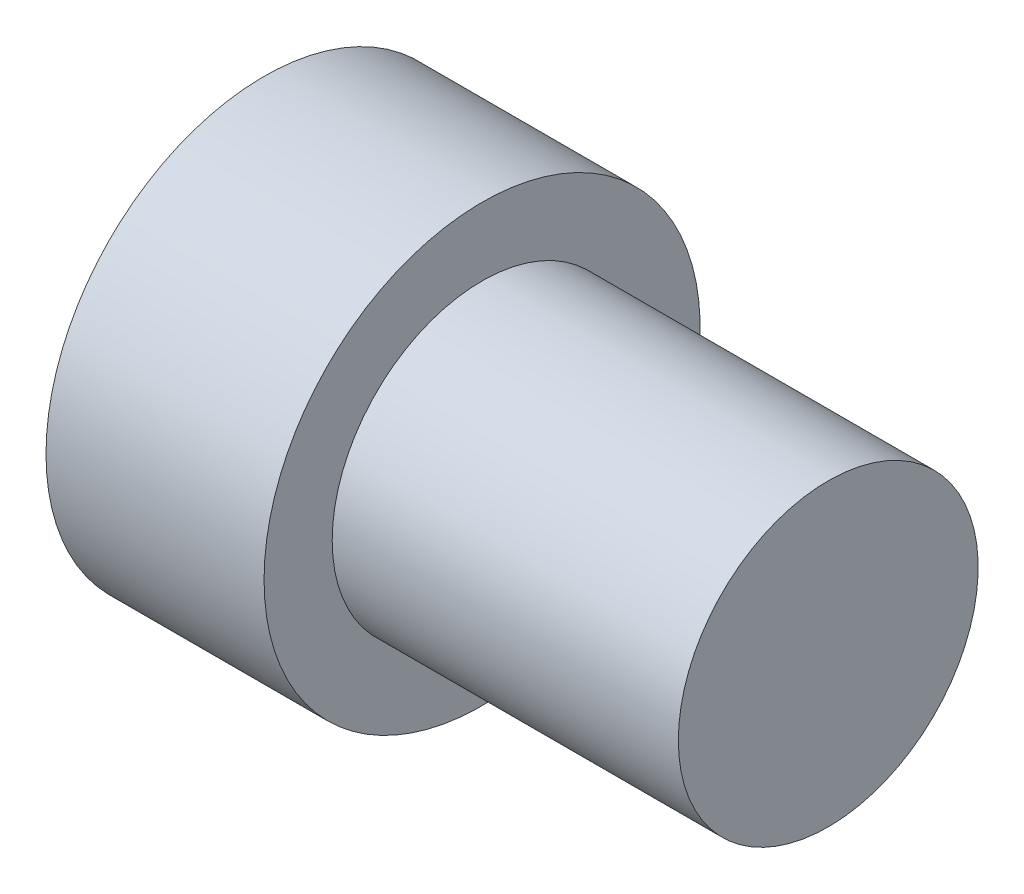
ISO-10303-21;
HEADER;
FILE_DESCRIPTION(('STEP AP214'),'2;1');
FILE_NAME('part.step','',(''),(''),'','','');
FILE_SCHEMA(('AUTOMOTIVE_DESIGN { 1 0 10303 214 1 1 1 1 }'));
ENDSEC;
DATA;
#1=APPLICATION_CONTEXT('core data for automotive mechanical design processes');
#2=APPLICATION_PROTOCOL_DEFINITION('international standard','automotive_design',2000,#1);
#3=PRODUCT_CONTEXT('',#1,'mechanical');
#4=PRODUCT('Part','Part','',(#3));
#5=PRODUCT_RELATED_PRODUCT_CATEGORY('part','',(#4));
#6=PRODUCT_DEFINITION_FORMATION('','',#4);
#7=PRODUCT_DEFINITION_CONTEXT('part definition',#1,'design');
#8=PRODUCT_DEFINITION('design','',#6,#7);
#9=PRODUCT_DEFINITION_SHAPE('','',#8);
#10=(LENGTH_UNIT() NAMED_UNIT(*) SI_UNIT(.MILLI.,.METRE.));
#11=(NAMED_UNIT(*) PLANE_ANGLE_UNIT() SI_UNIT($,.RADIAN.));
#12=(NAMED_UNIT(*) SI_UNIT($,.STERADIAN.) SOLID_ANGLE_UNIT());
#13=UNCERTAINTY_MEASURE_WITH_UNIT(LENGTH_MEASURE(1.E-05),#10,'distance_accuracy_value','');
#14=(GEOMETRIC_REPRESENTATION_CONTEXT(3) GLOBAL_UNCERTAINTY_ASSIGNED_CONTEXT((#13)) GLOBAL_UNIT_ASSIGNED_CONTEXT((#10,
#11,#12)) REPRESENTATION_CONTEXT('',''));
#15=CARTESIAN_POINT('',(0.,0.,0.));
#16=DIRECTION('',(0.,0.,1.));
#17=DIRECTION('',(1.,0.,0.));
#18=AXIS2_PLACEMENT_3D('',#15,#16,#17);
#19=CARTESIAN_POINT('',(12.7,0.,0.));
#20=DIRECTION('',(-1.,0.,0.));
#21=DIRECTION('',(0.,0.,1.));
#22=AXIS2_PLACEMENT_3D('',#19,#20,#21);
#23=PLANE('',#22);
#24=CARTESIAN_POINT('',(12.6999999999999,0.,0.));
#25=DIRECTION('',(-1.,0.,0.));
#26=DIRECTION('',(0.,0.,1.));
#27=AXIS2_PLACEMENT_3D('',#24,#25,#26);
#28=CIRCLE('',#27,5.5);
#29=CARTESIAN_POINT('',(12.6999999999999,0.,5.5));
#30=VERTEX_POINT('',#29);
#31=EDGE_CURVE('E10',#30,#30,#28,.T.);
#32=ORIENTED_EDGE('',*,*,#31,.F.);
#33=EDGE_LOOP('',(#32));
#34=FACE_BOUND('',#33,.T.);
#35=ADVANCED_FACE('F39',(#34),#23,.F.);
#36=CARTESIAN_POINT('',(-1000.,0.,0.));
#37=DIRECTION('',(-1.,0.,0.));
#38=DIRECTION('',(0.,0.,1.));
#39=AXIS2_PLACEMENT_3D('',#36,#37,#38);
#40=CYLINDRICAL_SURFACE('',#39,5.5);
#41=CARTESIAN_POINT('',(0.,0.,0.));
#42=DIRECTION('',(-1.,0.,0.));
#43=DIRECTION('',(0.,0.,1.));
#44=AXIS2_PLACEMENT_3D('',#41,#42,#43);
#45=CIRCLE('',#44,5.5);
#46=CARTESIAN_POINT('',(0.,0.,5.5));
#47=VERTEX_POINT('',#46);
#48=EDGE_CURVE('E44',#47,#47,#45,.T.);
#49=ORIENTED_EDGE('',*,*,#48,.F.);
#50=EDGE_LOOP('',(#49));
#51=FACE_BOUND('',#50,.T.);
#52=ORIENTED_EDGE('',*,*,#31,.T.);
#53=EDGE_LOOP('',(#52));
#54=FACE_BOUND('',#53,.T.);
#55=ADVANCED_FACE('F66',(#51,#54),#40,.T.);
#56=CARTESIAN_POINT('',(0.,5.5,0.));
#57=DIRECTION('',(-1.,0.,0.));
#58=DIRECTION('',(0.,0.,1.));
#59=AXIS2_PLACEMENT_3D('',#56,#57,#58);
#60=PLANE('',#59);
#61=CARTESIAN_POINT('',(0.,0.,0.));
#62=DIRECTION('',(-1.,0.,0.));
#63=DIRECTION('',(0.,0.,1.));
#64=AXIS2_PLACEMENT_3D('',#61,#62,#63);
#65=CIRCLE('',#64,8.);
#66=CARTESIAN_POINT('',(0.,0.,8.));
#67=VERTEX_POINT('',#66);
#68=EDGE_CURVE('E47',#67,#67,#65,.T.);
#69=ORIENTED_EDGE('',*,*,#68,.F.);
#70=EDGE_LOOP('',(#69));
#71=FACE_BOUND('',#70,.T.);
#72=ORIENTED_EDGE('',*,*,#48,.T.);
#73=EDGE_LOOP('',(#72));
#74=FACE_BOUND('',#73,.T.);
#75=ADVANCED_FACE('F61',(#71,#74),#60,.F.);
#76=CARTESIAN_POINT('',(-1000.,0.,0.));
#77=DIRECTION('',(-1.,0.,0.));
#78=DIRECTION('',(0.,0.,1.));
#79=AXIS2_PLACEMENT_3D('',#76,#77,#78);
#80=CYLINDRICAL_SURFACE('',#79,8.);
#81=CARTESIAN_POINT('',(-8.00000000000001,0.,0.));
#82=DIRECTION('',(-1.,0.,0.));
#83=DIRECTION('',(0.,0.,1.));
#84=AXIS2_PLACEMENT_3D('',#81,#82,#83);
#85=CIRCLE('',#84,8.);
#86=CARTESIAN_POINT('',(-8.00000000000001,0.,8.));
#87=VERTEX_POINT('',#86);
#88=EDGE_CURVE('E52',#87,#87,#85,.T.);
#89=ORIENTED_EDGE('',*,*,#88,.F.);
#90=EDGE_LOOP('',(#89));
#91=FACE_BOUND('',#90,.T.);
#92=ORIENTED_EDGE('',*,*,#68,.T.);
#93=EDGE_LOOP('',(#92));
#94=FACE_BOUND('',#93,.T.);
#95=ADVANCED_FACE('F62',(#91,#94),#80,.T.);
#96=CARTESIAN_POINT('',(-8.,8.,0.));
#97=DIRECTION('',(1.,0.,0.));
#98=DIRECTION('',(0.,0.,-1.));
#99=AXIS2_PLACEMENT_3D('',#96,#97,#98);
#100=PLANE('',#99);
#101=ORIENTED_EDGE('',*,*,#88,.T.);
#102=EDGE_LOOP('',(#101));
#103=FACE_BOUND('',#102,.T.);
#104=ADVANCED_FACE('F56',(#103),#100,.F.);
#105=CLOSED_SHELL('',(#35,#55,#75,#95,#104));
#106=MANIFOLD_SOLID_BREP('B2',#105);
#107=ADVANCED_BREP_SHAPE_REPRESENTATION('',(#18,#106),#14);
#108=SHAPE_DEFINITION_REPRESENTATION(#9,#107);
ENDSEC;
END-ISO-10303-21;
